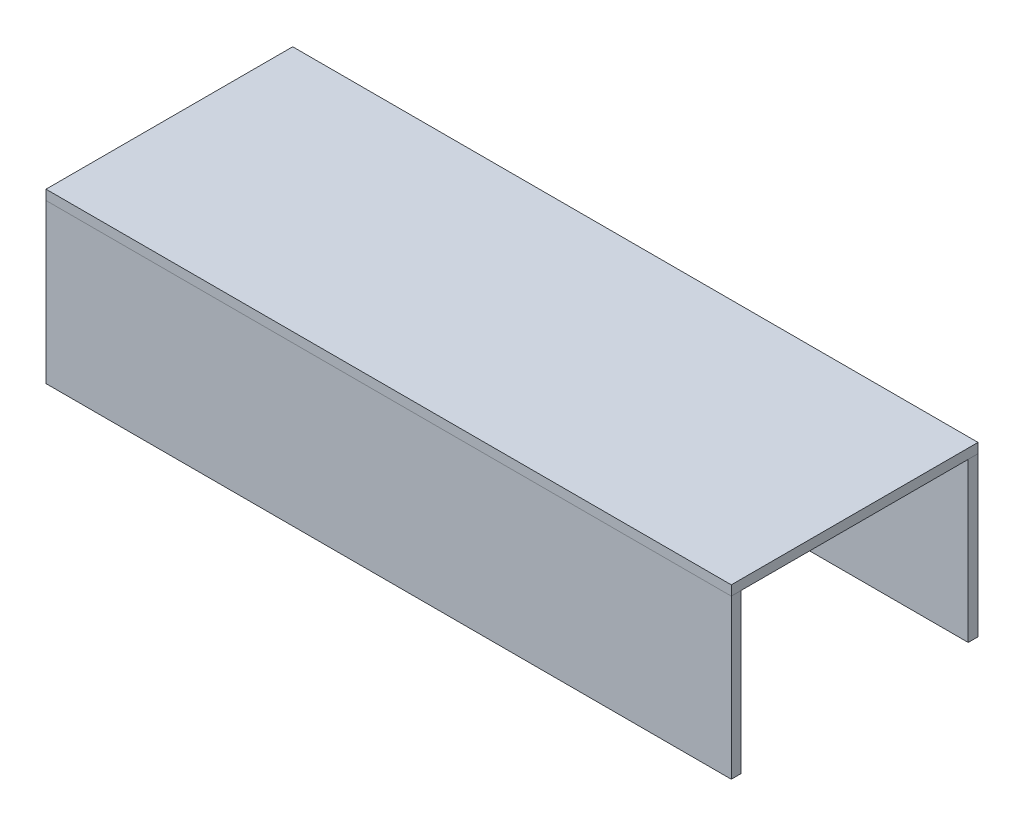
ISO-10303-21;
HEADER;
FILE_DESCRIPTION(('STEP AP214'),'2;1');
FILE_NAME('part.step','',(''),(''),'','','');
FILE_SCHEMA(('AUTOMOTIVE_DESIGN { 1 0 10303 214 1 1 1 1 }'));
ENDSEC;
DATA;
#1=APPLICATION_CONTEXT('core data for automotive mechanical design processes');
#2=APPLICATION_PROTOCOL_DEFINITION('international standard','automotive_design',2000,#1);
#3=PRODUCT_CONTEXT('',#1,'mechanical');
#4=PRODUCT('Part','Part','',(#3));
#5=PRODUCT_RELATED_PRODUCT_CATEGORY('part','',(#4));
#6=PRODUCT_DEFINITION_FORMATION('','',#4);
#7=PRODUCT_DEFINITION_CONTEXT('part definition',#1,'design');
#8=PRODUCT_DEFINITION('design','',#6,#7);
#9=PRODUCT_DEFINITION_SHAPE('','',#8);
#10=(LENGTH_UNIT() NAMED_UNIT(*) SI_UNIT(.MILLI.,.METRE.));
#11=(NAMED_UNIT(*) PLANE_ANGLE_UNIT() SI_UNIT($,.RADIAN.));
#12=(NAMED_UNIT(*) SI_UNIT($,.STERADIAN.) SOLID_ANGLE_UNIT());
#13=UNCERTAINTY_MEASURE_WITH_UNIT(LENGTH_MEASURE(1.E-05),#10,'distance_accuracy_value','');
#14=(GEOMETRIC_REPRESENTATION_CONTEXT(3) GLOBAL_UNCERTAINTY_ASSIGNED_CONTEXT((#13)) GLOBAL_UNIT_ASSIGNED_CONTEXT((#10,
#11,#12)) REPRESENTATION_CONTEXT('',''));
#15=CARTESIAN_POINT('',(0.,0.,0.));
#16=DIRECTION('',(0.,0.,1.));
#17=DIRECTION('',(1.,0.,0.));
#18=AXIS2_PLACEMENT_3D('',#15,#16,#17);
#19=CARTESIAN_POINT('',(17500.,-250.,0.));
#20=DIRECTION('',(0.,0.,1.));
#21=DIRECTION('',(0.,-1.,0.));
#22=AXIS2_PLACEMENT_3D('',#19,#20,#21);
#23=PLANE('',#22);
#24=DIRECTION('',(0.,1.,0.));
#25=VECTOR('',#24,1.);
#26=CARTESIAN_POINT('',(0.,-250.,0.));
#27=LINE('',#26,#25);
#28=CARTESIAN_POINT('',(0.,-4300.,0.));
#29=VERTEX_POINT('',#28);
#30=CARTESIAN_POINT('',(0.,-250.,0.));
#31=VERTEX_POINT('',#30);
#32=EDGE_CURVE('E107',#29,#31,#27,.T.);
#33=ORIENTED_EDGE('',*,*,#32,.T.);
#34=DIRECTION('',(-1.,0.,0.));
#35=VECTOR('',#34,1.);
#36=CARTESIAN_POINT('',(17500.,-250.,0.));
#37=LINE('',#36,#35);
#38=CARTESIAN_POINT('',(17500.,-250.,0.));
#39=VERTEX_POINT('',#38);
#40=EDGE_CURVE('E12',#39,#31,#37,.T.);
#41=ORIENTED_EDGE('',*,*,#40,.F.);
#42=DIRECTION('',(0.,1.,0.));
#43=VECTOR('',#42,1.);
#44=CARTESIAN_POINT('',(17500.,-250.,0.));
#45=LINE('',#44,#43);
#46=CARTESIAN_POINT('',(17500.,-4300.,0.));
#47=VERTEX_POINT('',#46);
#48=EDGE_CURVE('E95',#47,#39,#45,.T.);
#49=ORIENTED_EDGE('',*,*,#48,.F.);
#50=DIRECTION('',(-1.,0.,0.));
#51=VECTOR('',#50,1.);
#52=CARTESIAN_POINT('',(17500.,-4300.,0.));
#53=LINE('',#52,#51);
#54=EDGE_CURVE('E103',#47,#29,#53,.T.);
#55=ORIENTED_EDGE('',*,*,#54,.T.);
#56=EDGE_LOOP('',(#33,#41,#49,#55));
#57=FACE_BOUND('',#56,.T.);
#58=ADVANCED_FACE('F44',(#57),#23,.F.);
#59=CARTESIAN_POINT('',(17500.,-250.,0.));
#60=DIRECTION('',(0.,-1.,0.));
#61=DIRECTION('',(0.,0.,-1.));
#62=AXIS2_PLACEMENT_3D('',#59,#60,#61);
#63=PLANE('',#62);
#64=DIRECTION('',(0.,0.,1.));
#65=VECTOR('',#64,1.);
#66=CARTESIAN_POINT('',(0.,-250.,0.));
#67=LINE('',#66,#65);
#68=CARTESIAN_POINT('',(0.,-250.,250.));
#69=VERTEX_POINT('',#68);
#70=EDGE_CURVE('E99',#31,#69,#67,.T.);
#71=ORIENTED_EDGE('',*,*,#70,.T.);
#72=DIRECTION('',(-1.,0.,0.));
#73=VECTOR('',#72,1.);
#74=CARTESIAN_POINT('',(17500.,-250.,250.));
#75=LINE('',#74,#73);
#76=CARTESIAN_POINT('',(17500.,-250.,250.));
#77=VERTEX_POINT('',#76);
#78=EDGE_CURVE('E52',#77,#69,#75,.T.);
#79=ORIENTED_EDGE('',*,*,#78,.F.);
#80=DIRECTION('',(0.,0.,1.));
#81=VECTOR('',#80,1.);
#82=CARTESIAN_POINT('',(17500.,-250.,0.));
#83=LINE('',#82,#81);
#84=EDGE_CURVE('E90',#39,#77,#83,.T.);
#85=ORIENTED_EDGE('',*,*,#84,.F.);
#86=ORIENTED_EDGE('',*,*,#40,.T.);
#87=EDGE_LOOP('',(#71,#79,#85,#86));
#88=FACE_BOUND('',#87,.T.);
#89=ADVANCED_FACE('F98',(#88),#63,.F.);
#90=CARTESIAN_POINT('',(17500.,-250.,250.));
#91=DIRECTION('',(0.,0.,-1.));
#92=DIRECTION('',(0.,1.,0.));
#93=AXIS2_PLACEMENT_3D('',#90,#91,#92);
#94=PLANE('',#93);
#95=DIRECTION('',(0.,-1.,0.));
#96=VECTOR('',#95,1.);
#97=CARTESIAN_POINT('',(0.,-250.,250.));
#98=LINE('',#97,#96);
#99=CARTESIAN_POINT('',(0.,-4300.,250.));
#100=VERTEX_POINT('',#99);
#101=EDGE_CURVE('E77',#69,#100,#98,.T.);
#102=ORIENTED_EDGE('',*,*,#101,.T.);
#103=DIRECTION('',(-1.,0.,0.));
#104=VECTOR('',#103,1.);
#105=CARTESIAN_POINT('',(17500.,-4300.,250.));
#106=LINE('',#105,#104);
#107=CARTESIAN_POINT('',(17500.,-4300.,250.));
#108=VERTEX_POINT('',#107);
#109=EDGE_CURVE('E100',#108,#100,#106,.T.);
#110=ORIENTED_EDGE('',*,*,#109,.F.);
#111=DIRECTION('',(0.,-1.,0.));
#112=VECTOR('',#111,1.);
#113=CARTESIAN_POINT('',(17500.,-250.,250.));
#114=LINE('',#113,#112);
#115=EDGE_CURVE('E93',#77,#108,#114,.T.);
#116=ORIENTED_EDGE('',*,*,#115,.F.);
#117=ORIENTED_EDGE('',*,*,#78,.T.);
#118=EDGE_LOOP('',(#102,#110,#116,#117));
#119=FACE_BOUND('',#118,.T.);
#120=ADVANCED_FACE('F101',(#119),#94,.F.);
#121=CARTESIAN_POINT('',(17500.,-4300.,0.));
#122=DIRECTION('',(0.,1.,0.));
#123=DIRECTION('',(0.,0.,1.));
#124=AXIS2_PLACEMENT_3D('',#121,#122,#123);
#125=PLANE('',#124);
#126=DIRECTION('',(0.,0.,-1.));
#127=VECTOR('',#126,1.);
#128=CARTESIAN_POINT('',(0.,-4300.,0.));
#129=LINE('',#128,#127);
#130=EDGE_CURVE('E83',#100,#29,#129,.T.);
#131=ORIENTED_EDGE('',*,*,#130,.T.);
#132=ORIENTED_EDGE('',*,*,#54,.F.);
#133=DIRECTION('',(0.,0.,-1.));
#134=VECTOR('',#133,1.);
#135=CARTESIAN_POINT('',(17500.,-4300.,0.));
#136=LINE('',#135,#134);
#137=EDGE_CURVE('E60',#108,#47,#136,.T.);
#138=ORIENTED_EDGE('',*,*,#137,.F.);
#139=ORIENTED_EDGE('',*,*,#109,.T.);
#140=EDGE_LOOP('',(#131,#132,#138,#139));
#141=FACE_BOUND('',#140,.T.);
#142=ADVANCED_FACE('F114',(#141),#125,.F.);
#143=CARTESIAN_POINT('',(17500.,-4300.,0.));
#144=DIRECTION('',(-1.,0.,0.));
#145=DIRECTION('',(0.,0.,1.));
#146=AXIS2_PLACEMENT_3D('',#143,#144,#145);
#147=PLANE('',#146);
#148=ORIENTED_EDGE('',*,*,#48,.T.);
#149=ORIENTED_EDGE('',*,*,#84,.T.);
#150=ORIENTED_EDGE('',*,*,#115,.T.);
#151=ORIENTED_EDGE('',*,*,#137,.T.);
#152=EDGE_LOOP('',(#148,#149,#150,#151));
#153=FACE_BOUND('',#152,.T.);
#154=ADVANCED_FACE('F91',(#153),#147,.F.);
#155=CARTESIAN_POINT('',(0.,-4300.,0.));
#156=DIRECTION('',(-1.,0.,0.));
#157=DIRECTION('',(0.,0.,1.));
#158=AXIS2_PLACEMENT_3D('',#155,#156,#157);
#159=PLANE('',#158);
#160=ORIENTED_EDGE('',*,*,#32,.F.);
#161=ORIENTED_EDGE('',*,*,#130,.F.);
#162=ORIENTED_EDGE('',*,*,#101,.F.);
#163=ORIENTED_EDGE('',*,*,#70,.F.);
#164=EDGE_LOOP('',(#160,#161,#162,#163));
#165=FACE_BOUND('',#164,.T.);
#166=ADVANCED_FACE('F117',(#165),#159,.T.);
#167=CLOSED_SHELL('',(#58,#89,#120,#142,#154,#166));
#168=MANIFOLD_SOLID_BREP('B2',#167);
#169=CARTESIAN_POINT('',(17500.,-250.000000000001,6300.));
#170=DIRECTION('',(0.,0.,-1.));
#171=DIRECTION('',(0.,1.,0.));
#172=AXIS2_PLACEMENT_3D('',#169,#170,#171);
#173=PLANE('',#172);
#174=DIRECTION('',(0.,-1.,0.));
#175=VECTOR('',#174,1.);
#176=CARTESIAN_POINT('',(0.,-250.000000000001,6300.));
#177=LINE('',#176,#175);
#178=CARTESIAN_POINT('',(0.,-250.000000000001,6300.));
#179=VERTEX_POINT('',#178);
#180=CARTESIAN_POINT('',(0.,-4300.,6300.));
#181=VERTEX_POINT('',#180);
#182=EDGE_CURVE('E240',#179,#181,#177,.T.);
#183=ORIENTED_EDGE('',*,*,#182,.T.);
#184=DIRECTION('',(-1.,0.,0.));
#185=VECTOR('',#184,1.);
#186=CARTESIAN_POINT('',(17500.,-4300.,6300.));
#187=LINE('',#186,#185);
#188=CARTESIAN_POINT('',(17500.,-4300.,6300.));
#189=VERTEX_POINT('',#188);
#190=EDGE_CURVE('E42',#189,#181,#187,.T.);
#191=ORIENTED_EDGE('',*,*,#190,.F.);
#192=DIRECTION('',(0.,-1.,0.));
#193=VECTOR('',#192,1.);
#194=CARTESIAN_POINT('',(17500.,-250.000000000001,6300.));
#195=LINE('',#194,#193);
#196=CARTESIAN_POINT('',(17500.,-250.000000000001,6300.));
#197=VERTEX_POINT('',#196);
#198=EDGE_CURVE('E228',#197,#189,#195,.T.);
#199=ORIENTED_EDGE('',*,*,#198,.F.);
#200=DIRECTION('',(-1.,0.,0.));
#201=VECTOR('',#200,1.);
#202=CARTESIAN_POINT('',(17500.,-250.000000000001,6300.));
#203=LINE('',#202,#201);
#204=EDGE_CURVE('E236',#197,#179,#203,.T.);
#205=ORIENTED_EDGE('',*,*,#204,.T.);
#206=EDGE_LOOP('',(#183,#191,#199,#205));
#207=FACE_BOUND('',#206,.T.);
#208=ADVANCED_FACE('F177',(#207),#173,.F.);
#209=CARTESIAN_POINT('',(17500.,-4300.,6300.));
#210=DIRECTION('',(0.,1.,0.));
#211=DIRECTION('',(0.,0.,1.));
#212=AXIS2_PLACEMENT_3D('',#209,#210,#211);
#213=PLANE('',#212);
#214=DIRECTION('',(0.,0.,-1.));
#215=VECTOR('',#214,1.);
#216=CARTESIAN_POINT('',(0.,-4300.,6300.));
#217=LINE('',#216,#215);
#218=CARTESIAN_POINT('',(0.,-4300.,6050.));
#219=VERTEX_POINT('',#218);
#220=EDGE_CURVE('E232',#181,#219,#217,.T.);
#221=ORIENTED_EDGE('',*,*,#220,.T.);
#222=DIRECTION('',(-1.,0.,0.));
#223=VECTOR('',#222,1.);
#224=CARTESIAN_POINT('',(17500.,-4300.,6050.));
#225=LINE('',#224,#223);
#226=CARTESIAN_POINT('',(17500.,-4300.,6050.));
#227=VERTEX_POINT('',#226);
#228=EDGE_CURVE('E185',#227,#219,#225,.T.);
#229=ORIENTED_EDGE('',*,*,#228,.F.);
#230=DIRECTION('',(0.,0.,-1.));
#231=VECTOR('',#230,1.);
#232=CARTESIAN_POINT('',(17500.,-4300.,6300.));
#233=LINE('',#232,#231);
#234=EDGE_CURVE('E223',#189,#227,#233,.T.);
#235=ORIENTED_EDGE('',*,*,#234,.F.);
#236=ORIENTED_EDGE('',*,*,#190,.T.);
#237=EDGE_LOOP('',(#221,#229,#235,#236));
#238=FACE_BOUND('',#237,.T.);
#239=ADVANCED_FACE('F231',(#238),#213,.F.);
#240=CARTESIAN_POINT('',(17500.,-250.000000000001,6050.));
#241=DIRECTION('',(0.,0.,1.));
#242=DIRECTION('',(0.,-1.,0.));
#243=AXIS2_PLACEMENT_3D('',#240,#241,#242);
#244=PLANE('',#243);
#245=DIRECTION('',(0.,1.,0.));
#246=VECTOR('',#245,1.);
#247=CARTESIAN_POINT('',(0.,-250.000000000001,6050.));
#248=LINE('',#247,#246);
#249=CARTESIAN_POINT('',(0.,-250.000000000001,6050.));
#250=VERTEX_POINT('',#249);
#251=EDGE_CURVE('E210',#219,#250,#248,.T.);
#252=ORIENTED_EDGE('',*,*,#251,.T.);
#253=DIRECTION('',(-1.,0.,0.));
#254=VECTOR('',#253,1.);
#255=CARTESIAN_POINT('',(17500.,-250.000000000001,6050.));
#256=LINE('',#255,#254);
#257=CARTESIAN_POINT('',(17500.,-250.000000000001,6050.));
#258=VERTEX_POINT('',#257);
#259=EDGE_CURVE('E233',#258,#250,#256,.T.);
#260=ORIENTED_EDGE('',*,*,#259,.F.);
#261=DIRECTION('',(0.,1.,0.));
#262=VECTOR('',#261,1.);
#263=CARTESIAN_POINT('',(17500.,-250.000000000001,6050.));
#264=LINE('',#263,#262);
#265=EDGE_CURVE('E226',#227,#258,#264,.T.);
#266=ORIENTED_EDGE('',*,*,#265,.F.);
#267=ORIENTED_EDGE('',*,*,#228,.T.);
#268=EDGE_LOOP('',(#252,#260,#266,#267));
#269=FACE_BOUND('',#268,.T.);
#270=ADVANCED_FACE('F234',(#269),#244,.F.);
#271=CARTESIAN_POINT('',(17500.,-250.000000000001,6300.));
#272=DIRECTION('',(0.,-1.,0.));
#273=DIRECTION('',(0.,0.,-1.));
#274=AXIS2_PLACEMENT_3D('',#271,#272,#273);
#275=PLANE('',#274);
#276=DIRECTION('',(0.,0.,1.));
#277=VECTOR('',#276,1.);
#278=CARTESIAN_POINT('',(0.,-250.000000000001,6300.));
#279=LINE('',#278,#277);
#280=EDGE_CURVE('E216',#250,#179,#279,.T.);
#281=ORIENTED_EDGE('',*,*,#280,.T.);
#282=ORIENTED_EDGE('',*,*,#204,.F.);
#283=DIRECTION('',(0.,0.,1.));
#284=VECTOR('',#283,1.);
#285=CARTESIAN_POINT('',(17500.,-250.000000000001,6300.));
#286=LINE('',#285,#284);
#287=EDGE_CURVE('E193',#258,#197,#286,.T.);
#288=ORIENTED_EDGE('',*,*,#287,.F.);
#289=ORIENTED_EDGE('',*,*,#259,.T.);
#290=EDGE_LOOP('',(#281,#282,#288,#289));
#291=FACE_BOUND('',#290,.T.);
#292=ADVANCED_FACE('F247',(#291),#275,.F.);
#293=CARTESIAN_POINT('',(17500.,-4300.,6300.));
#294=DIRECTION('',(1.,0.,0.));
#295=DIRECTION('',(0.,0.,-1.));
#296=AXIS2_PLACEMENT_3D('',#293,#294,#295);
#297=PLANE('',#296);
#298=ORIENTED_EDGE('',*,*,#198,.T.);
#299=ORIENTED_EDGE('',*,*,#234,.T.);
#300=ORIENTED_EDGE('',*,*,#265,.T.);
#301=ORIENTED_EDGE('',*,*,#287,.T.);
#302=EDGE_LOOP('',(#298,#299,#300,#301));
#303=FACE_BOUND('',#302,.T.);
#304=ADVANCED_FACE('F224',(#303),#297,.T.);
#305=CARTESIAN_POINT('',(0.,-4300.,6300.));
#306=DIRECTION('',(1.,0.,0.));
#307=DIRECTION('',(0.,0.,-1.));
#308=AXIS2_PLACEMENT_3D('',#305,#306,#307);
#309=PLANE('',#308);
#310=ORIENTED_EDGE('',*,*,#182,.F.);
#311=ORIENTED_EDGE('',*,*,#280,.F.);
#312=ORIENTED_EDGE('',*,*,#251,.F.);
#313=ORIENTED_EDGE('',*,*,#220,.F.);
#314=EDGE_LOOP('',(#310,#311,#312,#313));
#315=FACE_BOUND('',#314,.T.);
#316=ADVANCED_FACE('F250',(#315),#309,.F.);
#317=CLOSED_SHELL('',(#208,#239,#270,#292,#304,#316));
#318=MANIFOLD_SOLID_BREP('B6',#317);
#319=CARTESIAN_POINT('',(17500.,0.,0.));
#320=DIRECTION('',(0.,0.,1.));
#321=DIRECTION('',(0.,-1.,0.));
#322=AXIS2_PLACEMENT_3D('',#319,#320,#321);
#323=PLANE('',#322);
#324=DIRECTION('',(0.,1.,0.));
#325=VECTOR('',#324,1.);
#326=CARTESIAN_POINT('',(0.,0.,0.));
#327=LINE('',#326,#325);
#328=CARTESIAN_POINT('',(0.,-250.,0.));
#329=VERTEX_POINT('',#328);
#330=CARTESIAN_POINT('',(0.,0.,0.));
#331=VERTEX_POINT('',#330);
#332=EDGE_CURVE('E364',#329,#331,#327,.T.);
#333=ORIENTED_EDGE('',*,*,#332,.T.);
#334=DIRECTION('',(-1.,0.,0.));
#335=VECTOR('',#334,1.);
#336=CARTESIAN_POINT('',(17500.,0.,0.));
#337=LINE('',#336,#335);
#338=CARTESIAN_POINT('',(17500.,0.,0.));
#339=VERTEX_POINT('',#338);
#340=EDGE_CURVE('E175',#339,#331,#337,.T.);
#341=ORIENTED_EDGE('',*,*,#340,.F.);
#342=DIRECTION('',(0.,1.,0.));
#343=VECTOR('',#342,1.);
#344=CARTESIAN_POINT('',(17500.,0.,0.));
#345=LINE('',#344,#343);
#346=CARTESIAN_POINT('',(17500.,-250.,0.));
#347=VERTEX_POINT('',#346);
#348=EDGE_CURVE('E352',#347,#339,#345,.T.);
#349=ORIENTED_EDGE('',*,*,#348,.F.);
#350=DIRECTION('',(-1.,0.,0.));
#351=VECTOR('',#350,1.);
#352=CARTESIAN_POINT('',(17500.,-250.,0.));
#353=LINE('',#352,#351);
#354=EDGE_CURVE('E360',#347,#329,#353,.T.);
#355=ORIENTED_EDGE('',*,*,#354,.T.);
#356=EDGE_LOOP('',(#333,#341,#349,#355));
#357=FACE_BOUND('',#356,.T.);
#358=ADVANCED_FACE('F301',(#357),#323,.F.);
#359=CARTESIAN_POINT('',(17500.,0.,0.));
#360=DIRECTION('',(0.,-1.,0.));
#361=DIRECTION('',(0.,0.,-1.));
#362=AXIS2_PLACEMENT_3D('',#359,#360,#361);
#363=PLANE('',#362);
#364=DIRECTION('',(0.,0.,1.));
#365=VECTOR('',#364,1.);
#366=CARTESIAN_POINT('',(0.,0.,0.));
#367=LINE('',#366,#365);
#368=CARTESIAN_POINT('',(0.,0.,6300.));
#369=VERTEX_POINT('',#368);
#370=EDGE_CURVE('E356',#331,#369,#367,.T.);
#371=ORIENTED_EDGE('',*,*,#370,.T.);
#372=DIRECTION('',(-1.,0.,0.));
#373=VECTOR('',#372,1.);
#374=CARTESIAN_POINT('',(17500.,0.,6300.));
#375=LINE('',#374,#373);
#376=CARTESIAN_POINT('',(17500.,0.,6300.));
#377=VERTEX_POINT('',#376);
#378=EDGE_CURVE('E309',#377,#369,#375,.T.);
#379=ORIENTED_EDGE('',*,*,#378,.F.);
#380=DIRECTION('',(0.,0.,1.));
#381=VECTOR('',#380,1.);
#382=CARTESIAN_POINT('',(17500.,0.,0.));
#383=LINE('',#382,#381);
#384=EDGE_CURVE('E347',#339,#377,#383,.T.);
#385=ORIENTED_EDGE('',*,*,#384,.F.);
#386=ORIENTED_EDGE('',*,*,#340,.T.);
#387=EDGE_LOOP('',(#371,#379,#385,#386));
#388=FACE_BOUND('',#387,.T.);
#389=ADVANCED_FACE('F355',(#388),#363,.F.);
#390=CARTESIAN_POINT('',(17500.,0.,6300.));
#391=DIRECTION('',(0.,0.,-1.));
#392=DIRECTION('',(-1.,0.,0.));
#393=AXIS2_PLACEMENT_3D('',#390,#391,#392);
#394=PLANE('',#393);
#395=DIRECTION('',(0.,-1.,0.));
#396=VECTOR('',#395,1.);
#397=CARTESIAN_POINT('',(0.,0.,6300.));
#398=LINE('',#397,#396);
#399=CARTESIAN_POINT('',(0.,-250.000000000001,6300.));
#400=VERTEX_POINT('',#399);
#401=EDGE_CURVE('E334',#369,#400,#398,.T.);
#402=ORIENTED_EDGE('',*,*,#401,.T.);
#403=DIRECTION('',(-1.,0.,0.));
#404=VECTOR('',#403,1.);
#405=CARTESIAN_POINT('',(17500.,-250.000000000001,6300.));
#406=LINE('',#405,#404);
#407=CARTESIAN_POINT('',(17500.,-250.000000000001,6300.));
#408=VERTEX_POINT('',#407);
#409=EDGE_CURVE('E357',#408,#400,#406,.T.);
#410=ORIENTED_EDGE('',*,*,#409,.F.);
#411=DIRECTION('',(0.,-1.,0.));
#412=VECTOR('',#411,1.);
#413=CARTESIAN_POINT('',(17500.,0.,6300.));
#414=LINE('',#413,#412);
#415=EDGE_CURVE('E350',#377,#408,#414,.T.);
#416=ORIENTED_EDGE('',*,*,#415,.F.);
#417=ORIENTED_EDGE('',*,*,#378,.T.);
#418=EDGE_LOOP('',(#402,#410,#416,#417));
#419=FACE_BOUND('',#418,.T.);
#420=ADVANCED_FACE('F358',(#419),#394,.F.);
#421=CARTESIAN_POINT('',(17500.,-250.,0.));
#422=DIRECTION('',(0.,1.,0.));
#423=DIRECTION('',(0.,0.,1.));
#424=AXIS2_PLACEMENT_3D('',#421,#422,#423);
#425=PLANE('',#424);
#426=DIRECTION('',(0.,0.,-1.));
#427=VECTOR('',#426,1.);
#428=CARTESIAN_POINT('',(0.,-250.,0.));
#429=LINE('',#428,#427);
#430=EDGE_CURVE('E340',#400,#329,#429,.T.);
#431=ORIENTED_EDGE('',*,*,#430,.T.);
#432=ORIENTED_EDGE('',*,*,#354,.F.);
#433=DIRECTION('',(0.,0.,-1.));
#434=VECTOR('',#433,1.);
#435=CARTESIAN_POINT('',(17500.,-250.,0.));
#436=LINE('',#435,#434);
#437=EDGE_CURVE('E317',#408,#347,#436,.T.);
#438=ORIENTED_EDGE('',*,*,#437,.F.);
#439=ORIENTED_EDGE('',*,*,#409,.T.);
#440=EDGE_LOOP('',(#431,#432,#438,#439));
#441=FACE_BOUND('',#440,.T.);
#442=ADVANCED_FACE('F371',(#441),#425,.F.);
#443=CARTESIAN_POINT('',(17500.,-250.,0.));
#444=DIRECTION('',(-1.,0.,0.));
#445=DIRECTION('',(0.,0.,1.));
#446=AXIS2_PLACEMENT_3D('',#443,#444,#445);
#447=PLANE('',#446);
#448=ORIENTED_EDGE('',*,*,#348,.T.);
#449=ORIENTED_EDGE('',*,*,#384,.T.);
#450=ORIENTED_EDGE('',*,*,#415,.T.);
#451=ORIENTED_EDGE('',*,*,#437,.T.);
#452=EDGE_LOOP('',(#448,#449,#450,#451));
#453=FACE_BOUND('',#452,.T.);
#454=ADVANCED_FACE('F348',(#453),#447,.F.);
#455=CARTESIAN_POINT('',(0.,-250.,0.));
#456=DIRECTION('',(-1.,0.,0.));
#457=DIRECTION('',(0.,0.,1.));
#458=AXIS2_PLACEMENT_3D('',#455,#456,#457);
#459=PLANE('',#458);
#460=ORIENTED_EDGE('',*,*,#332,.F.);
#461=ORIENTED_EDGE('',*,*,#430,.F.);
#462=ORIENTED_EDGE('',*,*,#401,.F.);
#463=ORIENTED_EDGE('',*,*,#370,.F.);
#464=EDGE_LOOP('',(#460,#461,#462,#463));
#465=FACE_BOUND('',#464,.T.);
#466=ADVANCED_FACE('F374',(#465),#459,.T.);
#467=CLOSED_SHELL('',(#358,#389,#420,#442,#454,#466));
#468=MANIFOLD_SOLID_BREP('B36',#467);
#469=ADVANCED_BREP_SHAPE_REPRESENTATION('',(#18,#168,#318,#468),#14);
#470=SHAPE_DEFINITION_REPRESENTATION(#9,#469);
ENDSEC;
END-ISO-10303-21;
